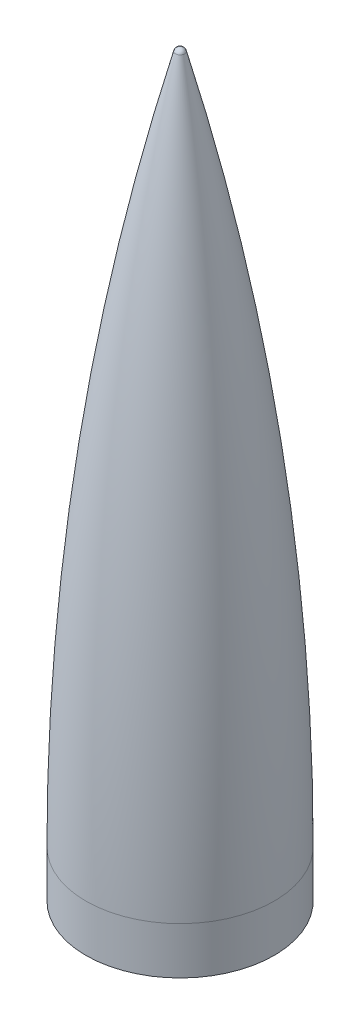
ISO-10303-21;
HEADER;
FILE_DESCRIPTION(('STEP AP214'),'2;1');
FILE_NAME('part.step','',(''),(''),'','','');
FILE_SCHEMA(('AUTOMOTIVE_DESIGN { 1 0 10303 214 1 1 1 1 }'));
ENDSEC;
DATA;
#1=APPLICATION_CONTEXT('core data for automotive mechanical design processes');
#2=APPLICATION_PROTOCOL_DEFINITION('international standard','automotive_design',2000,#1);
#3=PRODUCT_CONTEXT('',#1,'mechanical');
#4=PRODUCT('Part','Part','',(#3));
#5=PRODUCT_RELATED_PRODUCT_CATEGORY('part','',(#4));
#6=PRODUCT_DEFINITION_FORMATION('','',#4);
#7=PRODUCT_DEFINITION_CONTEXT('part definition',#1,'design');
#8=PRODUCT_DEFINITION('design','',#6,#7);
#9=PRODUCT_DEFINITION_SHAPE('','',#8);
#10=(LENGTH_UNIT() NAMED_UNIT(*) SI_UNIT(.MILLI.,.METRE.));
#11=(NAMED_UNIT(*) PLANE_ANGLE_UNIT() SI_UNIT($,.RADIAN.));
#12=(NAMED_UNIT(*) SI_UNIT($,.STERADIAN.) SOLID_ANGLE_UNIT());
#13=UNCERTAINTY_MEASURE_WITH_UNIT(LENGTH_MEASURE(1.E-05),#10,'distance_accuracy_value','');
#14=(GEOMETRIC_REPRESENTATION_CONTEXT(3) GLOBAL_UNCERTAINTY_ASSIGNED_CONTEXT((#13)) GLOBAL_UNIT_ASSIGNED_CONTEXT((#10,
#11,#12)) REPRESENTATION_CONTEXT('',''));
#15=CARTESIAN_POINT('',(0.,0.,0.));
#16=DIRECTION('',(0.,0.,1.));
#17=DIRECTION('',(1.,0.,0.));
#18=AXIS2_PLACEMENT_3D('',#15,#16,#17);
#19=CARTESIAN_POINT('',(40.,-19.9999999999999,0.));
#20=DIRECTION('',(0.,1.,0.));
#21=DIRECTION('',(0.,0.,1.));
#22=AXIS2_PLACEMENT_3D('',#19,#20,#21);
#23=PLANE('',#22);
#24=CARTESIAN_POINT('',(0.,-20.,0.));
#25=DIRECTION('',(0.,1.,0.));
#26=DIRECTION('',(0.,0.,1.));
#27=AXIS2_PLACEMENT_3D('',#24,#25,#26);
#28=CIRCLE('',#27,40.);
#29=CARTESIAN_POINT('',(0.,-20.,40.));
#30=VERTEX_POINT('',#29);
#31=EDGE_CURVE('E11',#30,#30,#28,.T.);
#32=ORIENTED_EDGE('',*,*,#31,.F.);
#33=EDGE_LOOP('',(#32));
#34=FACE_BOUND('',#33,.T.);
#35=CARTESIAN_POINT('',(0.,-19.9999999999999,0.));
#36=DIRECTION('',(0.,1.,0.));
#37=DIRECTION('',(0.,0.,1.));
#38=AXIS2_PLACEMENT_3D('',#35,#36,#37);
#39=CIRCLE('',#38,38.);
#40=CARTESIAN_POINT('',(0.,-19.9999999999999,38.));
#41=VERTEX_POINT('',#40);
#42=EDGE_CURVE('E72',#41,#41,#39,.T.);
#43=ORIENTED_EDGE('',*,*,#42,.T.);
#44=EDGE_LOOP('',(#43));
#45=FACE_BOUND('',#44,.T.);
#46=ADVANCED_FACE('F36',(#34,#45),#23,.F.);
#47=CARTESIAN_POINT('',(0.,294.273844194105,0.));
#48=DIRECTION('',(0.,1.,0.));
#49=DIRECTION('',(0.,0.,1.));
#50=AXIS2_PLACEMENT_3D('',#47,#48,#49);
#51=CYLINDRICAL_SURFACE('',#50,40.);
#52=CARTESIAN_POINT('',(0.,0.,0.));
#53=DIRECTION('',(0.,1.,0.));
#54=DIRECTION('',(0.,0.,1.));
#55=AXIS2_PLACEMENT_3D('',#52,#53,#54);
#56=CIRCLE('',#55,40.);
#57=CARTESIAN_POINT('',(0.,0.,40.));
#58=VERTEX_POINT('',#57);
#59=EDGE_CURVE('E42',#58,#58,#56,.T.);
#60=ORIENTED_EDGE('',*,*,#59,.F.);
#61=EDGE_LOOP('',(#60));
#62=FACE_BOUND('',#61,.T.);
#63=ORIENTED_EDGE('',*,*,#31,.T.);
#64=EDGE_LOOP('',(#63));
#65=FACE_BOUND('',#64,.T.);
#66=ADVANCED_FACE('F62',(#62,#65),#51,.T.);
#67=CARTESIAN_POINT('',(0.,0.,0.));
#68=DIRECTION('',(0.,1.,0.));
#69=DIRECTION('',(0.,0.,1.));
#70=AXIS2_PLACEMENT_3D('',#67,#68,#69);
#71=DEGENERATE_TOROIDAL_SURFACE('',#70,1105.,1145.,.F.);
#72=CARTESIAN_POINT('',(0.,292.785259494532,0.));
#73=DIRECTION('',(0.,1.,0.));
#74=DIRECTION('',(0.,0.,1.));
#75=AXIS2_PLACEMENT_3D('',#72,#73,#74);
#76=CIRCLE('',#75,1.93350831146111);
#77=CARTESIAN_POINT('',(0.,292.785259494532,1.93350831146111));
#78=VERTEX_POINT('',#77);
#79=EDGE_CURVE('E76',#78,#78,#76,.T.);
#80=ORIENTED_EDGE('',*,*,#79,.F.);
#81=EDGE_LOOP('',(#80));
#82=FACE_BOUND('',#81,.T.);
#83=ORIENTED_EDGE('',*,*,#59,.T.);
#84=EDGE_LOOP('',(#83));
#85=FACE_BOUND('',#84,.T.);
#86=ADVANCED_FACE('F57',(#82,#85),#71,.F.);
#87=CARTESIAN_POINT('',(0.,292.273844194105,0.));
#88=DIRECTION('',(0.,1.,0.));
#89=DIRECTION('',(1.,0.,0.));
#90=AXIS2_PLACEMENT_3D('',#87,#88,#89);
#91=SPHERICAL_SURFACE('',#90,1.99999999999983);
#92=ORIENTED_EDGE('',*,*,#79,.T.);
#93=EDGE_LOOP('',(#92));
#94=FACE_BOUND('',#93,.T.);
#95=ADVANCED_FACE('F48',(#94),#91,.T.);
#96=CARTESIAN_POINT('',(0.,0.,-1105.));
#97=DIRECTION('',(-1.,0.,0.));
#98=DIRECTION('',(0.,0.,1.));
#99=AXIS2_PLACEMENT_3D('',#96,#97,#98);
#100=CIRCLE('',#99,1143.);
#101=TRIMMED_CURVE('',#100,(PARAMETER_VALUE(-0.258579618121875)),
(PARAMETER_VALUE(0.258579618121875)),.T.,.PARAMETER.);
#102=CARTESIAN_POINT('',(0.,0.,0.));
#103=DIRECTION('',(0.,1.,0.));
#104=AXIS1_PLACEMENT('',#102,#103);
#105=SURFACE_OF_REVOLUTION('',#101,#104);
#106=CARTESIAN_POINT('',(0.,0.,0.));
#107=DIRECTION('',(0.,1.,0.));
#108=DIRECTION('',(0.,0.,1.));
#109=AXIS2_PLACEMENT_3D('',#106,#107,#108);
#110=CIRCLE('',#109,38.);
#111=CARTESIAN_POINT('',(0.,0.,38.));
#112=VERTEX_POINT('',#111);
#113=EDGE_CURVE('E73',#112,#112,#110,.T.);
#114=ORIENTED_EDGE('',*,*,#113,.F.);
#115=EDGE_LOOP('',(#114));
#116=FACE_BOUND('',#115,.T.);
#117=CARTESIAN_POINT('',(0.,292.273844194105,0.));
#118=VERTEX_POINT('',#117);
#119=VERTEX_LOOP('',#118);
#120=FACE_BOUND('',#119,.T.);
#121=ADVANCED_FACE('F45',(#116,#120),#105,.F.);
#122=CARTESIAN_POINT('',(0.,294.273844194105,0.));
#123=DIRECTION('',(0.,1.,0.));
#124=DIRECTION('',(0.,0.,1.));
#125=AXIS2_PLACEMENT_3D('',#122,#123,#124);
#126=CYLINDRICAL_SURFACE('',#125,38.);
#127=ORIENTED_EDGE('',*,*,#42,.F.);
#128=EDGE_LOOP('',(#127));
#129=FACE_BOUND('',#128,.T.);
#130=ORIENTED_EDGE('',*,*,#113,.T.);
#131=EDGE_LOOP('',(#130));
#132=FACE_BOUND('',#131,.T.);
#133=ADVANCED_FACE('F47',(#129,#132),#126,.F.);
#134=CLOSED_SHELL('',(#46,#66,#86,#95,#121,#133));
#135=MANIFOLD_SOLID_BREP('B2',#134);
#136=ADVANCED_BREP_SHAPE_REPRESENTATION('',(#18,#135),#14);
#137=SHAPE_DEFINITION_REPRESENTATION(#9,#136);
ENDSEC;
END-ISO-10303-21;
